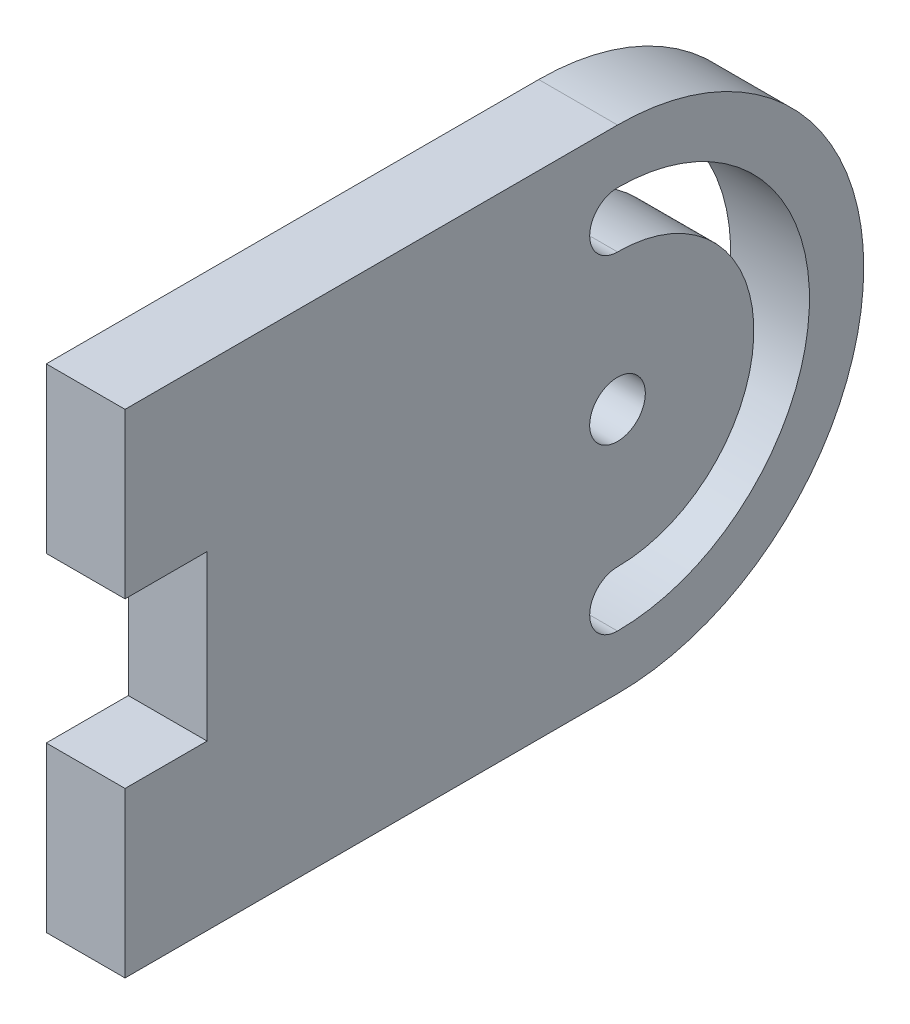
ISO-10303-21;
HEADER;
FILE_DESCRIPTION(('STEP AP214'),'2;1');
FILE_NAME('part.step','',(''),(''),'','','');
FILE_SCHEMA(('AUTOMOTIVE_DESIGN { 1 0 10303 214 1 1 1 1 }'));
ENDSEC;
DATA;
#1=APPLICATION_CONTEXT('core data for automotive mechanical design processes');
#2=APPLICATION_PROTOCOL_DEFINITION('international standard','automotive_design',2000,#1);
#3=PRODUCT_CONTEXT('',#1,'mechanical');
#4=PRODUCT('Part','Part','',(#3));
#5=PRODUCT_RELATED_PRODUCT_CATEGORY('part','',(#4));
#6=PRODUCT_DEFINITION_FORMATION('','',#4);
#7=PRODUCT_DEFINITION_CONTEXT('part definition',#1,'design');
#8=PRODUCT_DEFINITION('design','',#6,#7);
#9=PRODUCT_DEFINITION_SHAPE('','',#8);
#10=(LENGTH_UNIT() NAMED_UNIT(*) SI_UNIT(.MILLI.,.METRE.));
#11=(NAMED_UNIT(*) PLANE_ANGLE_UNIT() SI_UNIT($,.RADIAN.));
#12=(NAMED_UNIT(*) SI_UNIT($,.STERADIAN.) SOLID_ANGLE_UNIT());
#13=UNCERTAINTY_MEASURE_WITH_UNIT(LENGTH_MEASURE(1.E-05),#10,'distance_accuracy_value','');
#14=(GEOMETRIC_REPRESENTATION_CONTEXT(3) GLOBAL_UNCERTAINTY_ASSIGNED_CONTEXT((#13)) GLOBAL_UNIT_ASSIGNED_CONTEXT((#10,
#11,#12)) REPRESENTATION_CONTEXT('',''));
#15=CARTESIAN_POINT('',(0.,0.,0.));
#16=DIRECTION('',(0.,0.,1.));
#17=DIRECTION('',(1.,0.,0.));
#18=AXIS2_PLACEMENT_3D('',#15,#16,#17);
#19=CARTESIAN_POINT('',(3.048,0.,-31.75));
#20=DIRECTION('',(-1.,0.,0.));
#21=DIRECTION('',(0.,0.,1.));
#22=AXIS2_PLACEMENT_3D('',#19,#20,#21);
#23=PLANE('',#22);
#24=DIRECTION('',(0.,0.,-1.));
#25=VECTOR('',#24,1.);
#26=CARTESIAN_POINT('',(3.048,6.35,0.));
#27=LINE('',#26,#25);
#28=CARTESIAN_POINT('',(3.048,6.35,6.35));
#29=VERTEX_POINT('',#28);
#30=CARTESIAN_POINT('',(3.048,6.35,0.));
#31=VERTEX_POINT('',#30);
#32=EDGE_CURVE('E151',#29,#31,#27,.T.);
#33=ORIENTED_EDGE('',*,*,#32,.T.);
#34=DIRECTION('',(0.,-1.,0.));
#35=VECTOR('',#34,1.);
#36=CARTESIAN_POINT('',(3.048,6.35,0.));
#37=LINE('',#36,#35);
#38=CARTESIAN_POINT('',(3.048,-6.35,0.));
#39=VERTEX_POINT('',#38);
#40=EDGE_CURVE('E154',#31,#39,#37,.T.);
#41=ORIENTED_EDGE('',*,*,#40,.T.);
#42=DIRECTION('',(0.,0.,1.));
#43=VECTOR('',#42,1.);
#44=CARTESIAN_POINT('',(3.048,-6.35,0.));
#45=LINE('',#44,#43);
#46=CARTESIAN_POINT('',(3.048,-6.35,6.35));
#47=VERTEX_POINT('',#46);
#48=EDGE_CURVE('E157',#39,#47,#45,.T.);
#49=ORIENTED_EDGE('',*,*,#48,.T.);
#50=DIRECTION('',(0.,-1.,0.));
#51=VECTOR('',#50,1.);
#52=CARTESIAN_POINT('',(3.048,-6.35,6.35));
#53=LINE('',#52,#51);
#54=CARTESIAN_POINT('',(3.048,-19.05,6.35));
#55=VERTEX_POINT('',#54);
#56=EDGE_CURVE('E159',#47,#55,#53,.T.);
#57=ORIENTED_EDGE('',*,*,#56,.T.);
#58=DIRECTION('',(0.,0.,-1.));
#59=VECTOR('',#58,1.);
#60=CARTESIAN_POINT('',(3.048,-19.05,6.35));
#61=LINE('',#60,#59);
#62=CARTESIAN_POINT('',(3.048,-19.05,-31.75));
#63=VERTEX_POINT('',#62);
#64=EDGE_CURVE('E161',#55,#63,#61,.T.);
#65=ORIENTED_EDGE('',*,*,#64,.T.);
#66=CARTESIAN_POINT('',(3.048,0.,-31.75));
#67=DIRECTION('',(1.,0.,0.));
#68=DIRECTION('',(0.,0.,1.));
#69=AXIS2_PLACEMENT_3D('',#66,#67,#68);
#70=CIRCLE('',#69,19.05);
#71=CARTESIAN_POINT('',(3.048,19.05,-31.75));
#72=VERTEX_POINT('',#71);
#73=EDGE_CURVE('E163',#63,#72,#70,.T.);
#74=ORIENTED_EDGE('',*,*,#73,.T.);
#75=DIRECTION('',(0.,0.,1.));
#76=VECTOR('',#75,1.);
#77=CARTESIAN_POINT('',(3.048,19.05,6.35));
#78=LINE('',#77,#76);
#79=CARTESIAN_POINT('',(3.048,19.05,6.35));
#80=VERTEX_POINT('',#79);
#81=EDGE_CURVE('E165',#72,#80,#78,.T.);
#82=ORIENTED_EDGE('',*,*,#81,.T.);
#83=DIRECTION('',(0.,-1.,0.));
#84=VECTOR('',#83,1.);
#85=CARTESIAN_POINT('',(3.048,6.35,6.35));
#86=LINE('',#85,#84);
#87=EDGE_CURVE('E167',#80,#29,#86,.T.);
#88=ORIENTED_EDGE('',*,*,#87,.T.);
#89=EDGE_LOOP('',(#33,#41,#49,#57,#65,#74,#82,#88));
#90=FACE_BOUND('',#89,.T.);
#91=CARTESIAN_POINT('',(3.048,0.,-31.75));
#92=DIRECTION('',(1.,0.,0.));
#93=DIRECTION('',(0.,0.,-1.));
#94=AXIS2_PLACEMENT_3D('',#91,#92,#93);
#95=CIRCLE('',#94,2.15264999999999);
#96=CARTESIAN_POINT('',(3.048,0.,-33.90265));
#97=VERTEX_POINT('',#96);
#98=EDGE_CURVE('E290',#97,#97,#95,.T.);
#99=ORIENTED_EDGE('',*,*,#98,.F.);
#100=EDGE_LOOP('',(#99));
#101=FACE_BOUND('',#100,.T.);
#102=CARTESIAN_POINT('',(3.048,0.,-31.75));
#103=DIRECTION('',(1.,0.,0.));
#104=DIRECTION('',(0.,0.,-1.));
#105=AXIS2_PLACEMENT_3D('',#102,#103,#104);
#106=CIRCLE('',#105,14.85265);
#107=CARTESIAN_POINT('',(3.048,14.85265,-31.75));
#108=VERTEX_POINT('',#107);
#109=CARTESIAN_POINT('',(3.048,-14.85265,-31.75));
#110=VERTEX_POINT('',#109);
#111=EDGE_CURVE('E48',#108,#110,#106,.F.);
#112=ORIENTED_EDGE('',*,*,#111,.T.);
#113=CARTESIAN_POINT('',(3.048,-12.7,-31.75));
#114=DIRECTION('',(1.,0.,0.));
#115=DIRECTION('',(0.,0.,-1.));
#116=AXIS2_PLACEMENT_3D('',#113,#114,#115);
#117=CIRCLE('',#116,2.15264999999999);
#118=CARTESIAN_POINT('',(3.048,-10.54735,-31.75));
#119=VERTEX_POINT('',#118);
#120=EDGE_CURVE('E140',#119,#110,#117,.T.);
#121=ORIENTED_EDGE('',*,*,#120,.F.);
#122=CARTESIAN_POINT('',(3.048,0.,-31.75));
#123=DIRECTION('',(1.,0.,0.));
#124=DIRECTION('',(0.,0.,-1.));
#125=AXIS2_PLACEMENT_3D('',#122,#123,#124);
#126=CIRCLE('',#125,10.54735);
#127=CARTESIAN_POINT('',(3.048,10.54735,-31.75));
#128=VERTEX_POINT('',#127);
#129=EDGE_CURVE('E137',#128,#119,#126,.F.);
#130=ORIENTED_EDGE('',*,*,#129,.F.);
#131=CARTESIAN_POINT('',(3.048,12.7,-31.75));
#132=DIRECTION('',(1.,0.,0.));
#133=DIRECTION('',(0.,0.,-1.));
#134=AXIS2_PLACEMENT_3D('',#131,#132,#133);
#135=CIRCLE('',#134,2.15264999999999);
#136=EDGE_CURVE('E141',#108,#128,#135,.T.);
#137=ORIENTED_EDGE('',*,*,#136,.F.);
#138=EDGE_LOOP('',(#112,#121,#130,#137));
#139=FACE_BOUND('',#138,.T.);
#140=ADVANCED_FACE('F33',(#90,#101,#139),#23,.F.);
#141=CARTESIAN_POINT('',(-3.048,0.,-31.75));
#142=DIRECTION('',(-1.,0.,0.));
#143=DIRECTION('',(0.,0.,1.));
#144=AXIS2_PLACEMENT_3D('',#141,#142,#143);
#145=PLANE('',#144);
#146=DIRECTION('',(0.,0.,-1.));
#147=VECTOR('',#146,1.);
#148=CARTESIAN_POINT('',(-3.048,6.35,0.));
#149=LINE('',#148,#147);
#150=CARTESIAN_POINT('',(-3.048,6.35,6.35));
#151=VERTEX_POINT('',#150);
#152=CARTESIAN_POINT('',(-3.048,6.35,0.));
#153=VERTEX_POINT('',#152);
#154=EDGE_CURVE('E150',#151,#153,#149,.T.);
#155=ORIENTED_EDGE('',*,*,#154,.F.);
#156=DIRECTION('',(0.,-1.,0.));
#157=VECTOR('',#156,1.);
#158=CARTESIAN_POINT('',(-3.048,6.35,6.35));
#159=LINE('',#158,#157);
#160=CARTESIAN_POINT('',(-3.048,19.05,6.35));
#161=VERTEX_POINT('',#160);
#162=EDGE_CURVE('E155',#161,#151,#159,.T.);
#163=ORIENTED_EDGE('',*,*,#162,.F.);
#164=DIRECTION('',(0.,0.,1.));
#165=VECTOR('',#164,1.);
#166=CARTESIAN_POINT('',(-3.048,19.05,6.35));
#167=LINE('',#166,#165);
#168=CARTESIAN_POINT('',(-3.048,19.05,-31.75));
#169=VERTEX_POINT('',#168);
#170=EDGE_CURVE('E182',#169,#161,#167,.T.);
#171=ORIENTED_EDGE('',*,*,#170,.F.);
#172=CARTESIAN_POINT('',(-3.048,0.,-31.75));
#173=DIRECTION('',(1.,0.,0.));
#174=DIRECTION('',(0.,0.,1.));
#175=AXIS2_PLACEMENT_3D('',#172,#173,#174);
#176=CIRCLE('',#175,19.05);
#177=CARTESIAN_POINT('',(-3.048,-19.05,-31.75));
#178=VERTEX_POINT('',#177);
#179=EDGE_CURVE('E180',#178,#169,#176,.T.);
#180=ORIENTED_EDGE('',*,*,#179,.F.);
#181=DIRECTION('',(0.,0.,-1.));
#182=VECTOR('',#181,1.);
#183=CARTESIAN_POINT('',(-3.048,-19.05,6.35));
#184=LINE('',#183,#182);
#185=CARTESIAN_POINT('',(-3.048,-19.05,6.35));
#186=VERTEX_POINT('',#185);
#187=EDGE_CURVE('E178',#186,#178,#184,.T.);
#188=ORIENTED_EDGE('',*,*,#187,.F.);
#189=DIRECTION('',(0.,-1.,0.));
#190=VECTOR('',#189,1.);
#191=CARTESIAN_POINT('',(-3.048,-6.35,6.35));
#192=LINE('',#191,#190);
#193=CARTESIAN_POINT('',(-3.048,-6.35,6.35));
#194=VERTEX_POINT('',#193);
#195=EDGE_CURVE('E176',#194,#186,#192,.T.);
#196=ORIENTED_EDGE('',*,*,#195,.F.);
#197=DIRECTION('',(0.,0.,1.));
#198=VECTOR('',#197,1.);
#199=CARTESIAN_POINT('',(-3.048,-6.35,0.));
#200=LINE('',#199,#198);
#201=CARTESIAN_POINT('',(-3.048,-6.35,0.));
#202=VERTEX_POINT('',#201);
#203=EDGE_CURVE('E174',#202,#194,#200,.T.);
#204=ORIENTED_EDGE('',*,*,#203,.F.);
#205=DIRECTION('',(0.,-1.,0.));
#206=VECTOR('',#205,1.);
#207=CARTESIAN_POINT('',(-3.048,6.35,0.));
#208=LINE('',#207,#206);
#209=EDGE_CURVE('E172',#153,#202,#208,.T.);
#210=ORIENTED_EDGE('',*,*,#209,.F.);
#211=EDGE_LOOP('',(#155,#163,#171,#180,#188,#196,#204,#210));
#212=FACE_BOUND('',#211,.T.);
#213=CARTESIAN_POINT('',(-3.048,0.,-31.75));
#214=DIRECTION('',(1.,0.,0.));
#215=DIRECTION('',(0.,0.,-1.));
#216=AXIS2_PLACEMENT_3D('',#213,#214,#215);
#217=CIRCLE('',#216,2.15265);
#218=CARTESIAN_POINT('',(-3.048,0.,-33.90265));
#219=VERTEX_POINT('',#218);
#220=EDGE_CURVE('E145',#219,#219,#217,.T.);
#221=ORIENTED_EDGE('',*,*,#220,.T.);
#222=EDGE_LOOP('',(#221));
#223=FACE_BOUND('',#222,.T.);
#224=CARTESIAN_POINT('',(-3.048,-12.7,-31.75));
#225=DIRECTION('',(1.,0.,0.));
#226=DIRECTION('',(0.,0.,-1.));
#227=AXIS2_PLACEMENT_3D('',#224,#225,#226);
#228=CIRCLE('',#227,2.15265);
#229=CARTESIAN_POINT('',(-3.048,-10.54735,-31.75));
#230=VERTEX_POINT('',#229);
#231=CARTESIAN_POINT('',(-3.048,-14.85265,-31.75));
#232=VERTEX_POINT('',#231);
#233=EDGE_CURVE('E136',#230,#232,#228,.T.);
#234=ORIENTED_EDGE('',*,*,#233,.T.);
#235=CARTESIAN_POINT('',(-3.048,0.,-31.75));
#236=DIRECTION('',(1.,0.,0.));
#237=DIRECTION('',(0.,0.,-1.));
#238=AXIS2_PLACEMENT_3D('',#235,#236,#237);
#239=CIRCLE('',#238,14.85265);
#240=CARTESIAN_POINT('',(-3.048,14.85265,-31.75));
#241=VERTEX_POINT('',#240);
#242=EDGE_CURVE('E122',#241,#232,#239,.F.);
#243=ORIENTED_EDGE('',*,*,#242,.F.);
#244=CARTESIAN_POINT('',(-3.048,12.7,-31.75));
#245=DIRECTION('',(1.,0.,0.));
#246=DIRECTION('',(0.,0.,-1.));
#247=AXIS2_PLACEMENT_3D('',#244,#245,#246);
#248=CIRCLE('',#247,2.15265);
#249=CARTESIAN_POINT('',(-3.048,10.54735,-31.75));
#250=VERTEX_POINT('',#249);
#251=EDGE_CURVE('E134',#241,#250,#248,.T.);
#252=ORIENTED_EDGE('',*,*,#251,.T.);
#253=CARTESIAN_POINT('',(-3.048,0.,-31.75));
#254=DIRECTION('',(1.,0.,0.));
#255=DIRECTION('',(0.,0.,-1.));
#256=AXIS2_PLACEMENT_3D('',#253,#254,#255);
#257=CIRCLE('',#256,10.54735);
#258=EDGE_CURVE('E56',#250,#230,#257,.F.);
#259=ORIENTED_EDGE('',*,*,#258,.T.);
#260=EDGE_LOOP('',(#234,#243,#252,#259));
#261=FACE_BOUND('',#260,.T.);
#262=ADVANCED_FACE('F133',(#212,#223,#261),#145,.T.);
#263=CARTESIAN_POINT('',(3.048,-12.7,-31.75));
#264=DIRECTION('',(1.,0.,0.));
#265=DIRECTION('',(0.,0.,-1.));
#266=AXIS2_PLACEMENT_3D('',#263,#264,#265);
#267=CYLINDRICAL_SURFACE('',#266,2.15264999999999);
#268=DIRECTION('',(1.,0.,0.));
#269=VECTOR('',#268,1.);
#270=CARTESIAN_POINT('',(-3.048,-14.85265,-31.75));
#271=LINE('',#270,#269);
#272=EDGE_CURVE('E285',#232,#110,#271,.T.);
#273=ORIENTED_EDGE('',*,*,#272,.F.);
#274=ORIENTED_EDGE('',*,*,#233,.F.);
#275=DIRECTION('',(1.,0.,0.));
#276=VECTOR('',#275,1.);
#277=CARTESIAN_POINT('',(-3.048,-10.54735,-31.75));
#278=LINE('',#277,#276);
#279=EDGE_CURVE('E280',#230,#119,#278,.T.);
#280=ORIENTED_EDGE('',*,*,#279,.T.);
#281=ORIENTED_EDGE('',*,*,#120,.T.);
#282=EDGE_LOOP('',(#273,#274,#280,#281));
#283=FACE_BOUND('',#282,.T.);
#284=ADVANCED_FACE('F256',(#283),#267,.F.);
#285=CARTESIAN_POINT('',(3.048,6.35,0.));
#286=DIRECTION('',(0.,1.,0.));
#287=DIRECTION('',(0.,0.,1.));
#288=AXIS2_PLACEMENT_3D('',#285,#286,#287);
#289=PLANE('',#288);
#290=ORIENTED_EDGE('',*,*,#154,.T.);
#291=DIRECTION('',(-1.,0.,0.));
#292=VECTOR('',#291,1.);
#293=CARTESIAN_POINT('',(3.048,6.35,0.));
#294=LINE('',#293,#292);
#295=EDGE_CURVE('E11',#31,#153,#294,.T.);
#296=ORIENTED_EDGE('',*,*,#295,.F.);
#297=ORIENTED_EDGE('',*,*,#32,.F.);
#298=DIRECTION('',(-1.,0.,0.));
#299=VECTOR('',#298,1.);
#300=CARTESIAN_POINT('',(3.048,6.35,6.35));
#301=LINE('',#300,#299);
#302=EDGE_CURVE('E169',#29,#151,#301,.T.);
#303=ORIENTED_EDGE('',*,*,#302,.T.);
#304=EDGE_LOOP('',(#290,#296,#297,#303));
#305=FACE_BOUND('',#304,.T.);
#306=ADVANCED_FACE('F35',(#305),#289,.F.);
#307=CARTESIAN_POINT('',(3.048,6.35,0.));
#308=DIRECTION('',(0.,0.,-1.));
#309=DIRECTION('',(0.,1.,0.));
#310=AXIS2_PLACEMENT_3D('',#307,#308,#309);
#311=PLANE('',#310);
#312=ORIENTED_EDGE('',*,*,#209,.T.);
#313=DIRECTION('',(-1.,0.,0.));
#314=VECTOR('',#313,1.);
#315=CARTESIAN_POINT('',(3.048,-6.35,0.));
#316=LINE('',#315,#314);
#317=EDGE_CURVE('E41',#39,#202,#316,.T.);
#318=ORIENTED_EDGE('',*,*,#317,.F.);
#319=ORIENTED_EDGE('',*,*,#40,.F.);
#320=ORIENTED_EDGE('',*,*,#295,.T.);
#321=EDGE_LOOP('',(#312,#318,#319,#320));
#322=FACE_BOUND('',#321,.T.);
#323=ADVANCED_FACE('F229',(#322),#311,.F.);
#324=CARTESIAN_POINT('',(3.048,-6.35,0.));
#325=DIRECTION('',(0.,-1.,0.));
#326=DIRECTION('',(0.,0.,-1.));
#327=AXIS2_PLACEMENT_3D('',#324,#325,#326);
#328=PLANE('',#327);
#329=ORIENTED_EDGE('',*,*,#203,.T.);
#330=DIRECTION('',(-1.,0.,0.));
#331=VECTOR('',#330,1.);
#332=CARTESIAN_POINT('',(3.048,-6.35,6.35));
#333=LINE('',#332,#331);
#334=EDGE_CURVE('E199',#47,#194,#333,.T.);
#335=ORIENTED_EDGE('',*,*,#334,.F.);
#336=ORIENTED_EDGE('',*,*,#48,.F.);
#337=ORIENTED_EDGE('',*,*,#317,.T.);
#338=EDGE_LOOP('',(#329,#335,#336,#337));
#339=FACE_BOUND('',#338,.T.);
#340=ADVANCED_FACE('F206',(#339),#328,.F.);
#341=CARTESIAN_POINT('',(3.048,-6.35,6.35));
#342=DIRECTION('',(0.,0.,-1.));
#343=DIRECTION('',(0.,1.,0.));
#344=AXIS2_PLACEMENT_3D('',#341,#342,#343);
#345=PLANE('',#344);
#346=ORIENTED_EDGE('',*,*,#195,.T.);
#347=DIRECTION('',(-1.,0.,0.));
#348=VECTOR('',#347,1.);
#349=CARTESIAN_POINT('',(3.048,-19.05,6.35));
#350=LINE('',#349,#348);
#351=EDGE_CURVE('E196',#55,#186,#350,.T.);
#352=ORIENTED_EDGE('',*,*,#351,.F.);
#353=ORIENTED_EDGE('',*,*,#56,.F.);
#354=ORIENTED_EDGE('',*,*,#334,.T.);
#355=EDGE_LOOP('',(#346,#352,#353,#354));
#356=FACE_BOUND('',#355,.T.);
#357=ADVANCED_FACE('F217',(#356),#345,.F.);
#358=CARTESIAN_POINT('',(3.048,-19.05,6.35));
#359=DIRECTION('',(0.,1.,0.));
#360=DIRECTION('',(0.,0.,1.));
#361=AXIS2_PLACEMENT_3D('',#358,#359,#360);
#362=PLANE('',#361);
#363=ORIENTED_EDGE('',*,*,#187,.T.);
#364=DIRECTION('',(-1.,0.,0.));
#365=VECTOR('',#364,1.);
#366=CARTESIAN_POINT('',(3.048,-19.05,-31.75));
#367=LINE('',#366,#365);
#368=EDGE_CURVE('E193',#63,#178,#367,.T.);
#369=ORIENTED_EDGE('',*,*,#368,.F.);
#370=ORIENTED_EDGE('',*,*,#64,.F.);
#371=ORIENTED_EDGE('',*,*,#351,.T.);
#372=EDGE_LOOP('',(#363,#369,#370,#371));
#373=FACE_BOUND('',#372,.T.);
#374=ADVANCED_FACE('F221',(#373),#362,.F.);
#375=CARTESIAN_POINT('',(3.048,0.,-31.75));
#376=DIRECTION('',(-1.,0.,0.));
#377=DIRECTION('',(0.,0.,1.));
#378=AXIS2_PLACEMENT_3D('',#375,#376,#377);
#379=CYLINDRICAL_SURFACE('',#378,19.05);
#380=ORIENTED_EDGE('',*,*,#179,.T.);
#381=DIRECTION('',(-1.,0.,0.));
#382=VECTOR('',#381,1.);
#383=CARTESIAN_POINT('',(3.048,19.05,-31.75));
#384=LINE('',#383,#382);
#385=EDGE_CURVE('E190',#72,#169,#384,.T.);
#386=ORIENTED_EDGE('',*,*,#385,.F.);
#387=ORIENTED_EDGE('',*,*,#73,.F.);
#388=ORIENTED_EDGE('',*,*,#368,.T.);
#389=EDGE_LOOP('',(#380,#386,#387,#388));
#390=FACE_BOUND('',#389,.T.);
#391=ADVANCED_FACE('F242',(#390),#379,.T.);
#392=CARTESIAN_POINT('',(3.048,19.05,6.35));
#393=DIRECTION('',(0.,-1.,0.));
#394=DIRECTION('',(0.,0.,-1.));
#395=AXIS2_PLACEMENT_3D('',#392,#393,#394);
#396=PLANE('',#395);
#397=ORIENTED_EDGE('',*,*,#170,.T.);
#398=DIRECTION('',(-1.,0.,0.));
#399=VECTOR('',#398,1.);
#400=CARTESIAN_POINT('',(3.048,19.05,6.35));
#401=LINE('',#400,#399);
#402=EDGE_CURVE('E187',#80,#161,#401,.T.);
#403=ORIENTED_EDGE('',*,*,#402,.F.);
#404=ORIENTED_EDGE('',*,*,#81,.F.);
#405=ORIENTED_EDGE('',*,*,#385,.T.);
#406=EDGE_LOOP('',(#397,#403,#404,#405));
#407=FACE_BOUND('',#406,.T.);
#408=ADVANCED_FACE('F240',(#407),#396,.F.);
#409=CARTESIAN_POINT('',(3.048,6.35,6.35));
#410=DIRECTION('',(0.,0.,-1.));
#411=DIRECTION('',(0.,1.,0.));
#412=AXIS2_PLACEMENT_3D('',#409,#410,#411);
#413=PLANE('',#412);
#414=ORIENTED_EDGE('',*,*,#162,.T.);
#415=ORIENTED_EDGE('',*,*,#302,.F.);
#416=ORIENTED_EDGE('',*,*,#87,.F.);
#417=ORIENTED_EDGE('',*,*,#402,.T.);
#418=EDGE_LOOP('',(#414,#415,#416,#417));
#419=FACE_BOUND('',#418,.T.);
#420=ADVANCED_FACE('F235',(#419),#413,.F.);
#421=CARTESIAN_POINT('',(3.048,12.7,-31.75));
#422=DIRECTION('',(1.,0.,0.));
#423=DIRECTION('',(0.,0.,-1.));
#424=AXIS2_PLACEMENT_3D('',#421,#422,#423);
#425=CYLINDRICAL_SURFACE('',#424,2.15264999999999);
#426=ORIENTED_EDGE('',*,*,#251,.F.);
#427=DIRECTION('',(1.,0.,0.));
#428=VECTOR('',#427,1.);
#429=CARTESIAN_POINT('',(-3.048,14.85265,-31.75));
#430=LINE('',#429,#428);
#431=EDGE_CURVE('E119',#241,#108,#430,.T.);
#432=ORIENTED_EDGE('',*,*,#431,.T.);
#433=ORIENTED_EDGE('',*,*,#136,.T.);
#434=DIRECTION('',(1.,0.,0.));
#435=VECTOR('',#434,1.);
#436=CARTESIAN_POINT('',(-3.048,10.54735,-31.75));
#437=LINE('',#436,#435);
#438=EDGE_CURVE('E128',#250,#128,#437,.T.);
#439=ORIENTED_EDGE('',*,*,#438,.F.);
#440=EDGE_LOOP('',(#426,#432,#433,#439));
#441=FACE_BOUND('',#440,.T.);
#442=ADVANCED_FACE('F139',(#441),#425,.F.);
#443=CARTESIAN_POINT('',(3.048,0.,-31.75));
#444=DIRECTION('',(1.,0.,0.));
#445=DIRECTION('',(0.,0.,-1.));
#446=AXIS2_PLACEMENT_3D('',#443,#444,#445);
#447=CYLINDRICAL_SURFACE('',#446,2.15264999999999);
#448=ORIENTED_EDGE('',*,*,#220,.F.);
#449=EDGE_LOOP('',(#448));
#450=FACE_BOUND('',#449,.T.);
#451=ORIENTED_EDGE('',*,*,#98,.T.);
#452=EDGE_LOOP('',(#451));
#453=FACE_BOUND('',#452,.T.);
#454=ADVANCED_FACE('F265',(#450,#453),#447,.F.);
#455=CARTESIAN_POINT('',(-3.048,0.,-31.75));
#456=DIRECTION('',(1.,0.,0.));
#457=DIRECTION('',(0.,0.,-1.));
#458=AXIS2_PLACEMENT_3D('',#455,#456,#457);
#459=CYLINDRICAL_SURFACE('',#458,10.54735);
#460=ORIENTED_EDGE('',*,*,#129,.T.);
#461=ORIENTED_EDGE('',*,*,#279,.F.);
#462=ORIENTED_EDGE('',*,*,#258,.F.);
#463=ORIENTED_EDGE('',*,*,#438,.T.);
#464=EDGE_LOOP('',(#460,#461,#462,#463));
#465=FACE_BOUND('',#464,.T.);
#466=ADVANCED_FACE('F269',(#465),#459,.T.);
#467=CARTESIAN_POINT('',(-3.048,0.,-31.75));
#468=DIRECTION('',(1.,0.,0.));
#469=DIRECTION('',(0.,0.,-1.));
#470=AXIS2_PLACEMENT_3D('',#467,#468,#469);
#471=CYLINDRICAL_SURFACE('',#470,14.85265);
#472=ORIENTED_EDGE('',*,*,#111,.F.);
#473=ORIENTED_EDGE('',*,*,#431,.F.);
#474=ORIENTED_EDGE('',*,*,#242,.T.);
#475=ORIENTED_EDGE('',*,*,#272,.T.);
#476=EDGE_LOOP('',(#472,#473,#474,#475));
#477=FACE_BOUND('',#476,.T.);
#478=ADVANCED_FACE('F121',(#477),#471,.F.);
#479=CLOSED_SHELL('',(#140,#262,#284,#306,#323,#340,#357,#374,#391,#408,#420,#442,#454,#466,#478));
#480=MANIFOLD_SOLID_BREP('B2',#479);
#481=ADVANCED_BREP_SHAPE_REPRESENTATION('',(#18,#480),#14);
#482=SHAPE_DEFINITION_REPRESENTATION(#9,#481);
ENDSEC;
END-ISO-10303-21;
